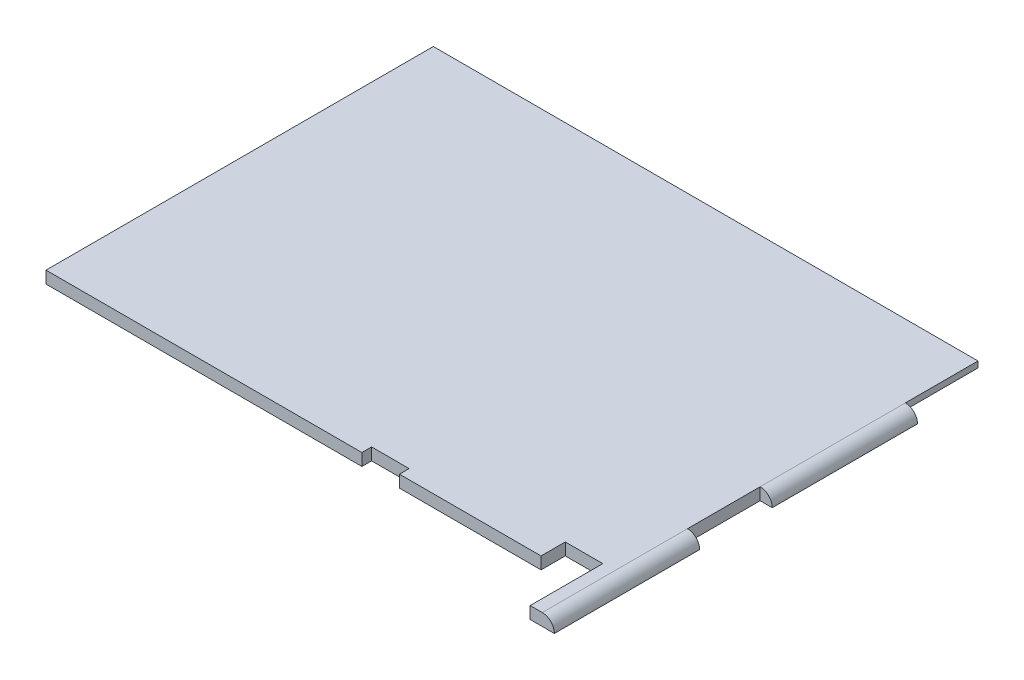
ISO-10303-21;
HEADER;
FILE_DESCRIPTION(('STEP AP214'),'2;1');
FILE_NAME('part.step','',(''),(''),'','','');
FILE_SCHEMA(('AUTOMOTIVE_DESIGN { 1 0 10303 214 1 1 1 1 }'));
ENDSEC;
DATA;
#1=APPLICATION_CONTEXT('core data for automotive mechanical design processes');
#2=APPLICATION_PROTOCOL_DEFINITION('international standard','automotive_design',2000,#1);
#3=PRODUCT_CONTEXT('',#1,'mechanical');
#4=PRODUCT('Part','Part','',(#3));
#5=PRODUCT_RELATED_PRODUCT_CATEGORY('part','',(#4));
#6=PRODUCT_DEFINITION_FORMATION('','',#4);
#7=PRODUCT_DEFINITION_CONTEXT('part definition',#1,'design');
#8=PRODUCT_DEFINITION('design','',#6,#7);
#9=PRODUCT_DEFINITION_SHAPE('','',#8);
#10=(LENGTH_UNIT() NAMED_UNIT(*) SI_UNIT(.MILLI.,.METRE.));
#11=(NAMED_UNIT(*) PLANE_ANGLE_UNIT() SI_UNIT($,.RADIAN.));
#12=(NAMED_UNIT(*) SI_UNIT($,.STERADIAN.) SOLID_ANGLE_UNIT());
#13=UNCERTAINTY_MEASURE_WITH_UNIT(LENGTH_MEASURE(1.E-05),#10,'distance_accuracy_value','');
#14=(GEOMETRIC_REPRESENTATION_CONTEXT(3) GLOBAL_UNCERTAINTY_ASSIGNED_CONTEXT((#13)) GLOBAL_UNIT_ASSIGNED_CONTEXT((#10,
#11,#12)) REPRESENTATION_CONTEXT('',''));
#15=CARTESIAN_POINT('',(0.,0.,0.));
#16=DIRECTION('',(0.,0.,1.));
#17=DIRECTION('',(1.,0.,0.));
#18=AXIS2_PLACEMENT_3D('',#15,#16,#17);
#19=CARTESIAN_POINT('',(0.,5.,286.464902660625));
#20=DIRECTION('',(0.,0.,-1.));
#21=DIRECTION('',(-1.,0.,0.));
#22=AXIS2_PLACEMENT_3D('',#19,#20,#21);
#23=PLANE('',#22);
#24=DIRECTION('',(1.,0.,0.));
#25=VECTOR('',#24,1.);
#26=CARTESIAN_POINT('',(0.,0.,286.464902660625));
#27=LINE('',#26,#25);
#28=CARTESIAN_POINT('',(198.746286717569,0.,286.464902660625));
#29=VERTEX_POINT('',#28);
#30=CARTESIAN_POINT('',(208.746286717569,0.,286.464902660625));
#31=VERTEX_POINT('',#30);
#32=EDGE_CURVE('E589',#29,#31,#27,.T.);
#33=ORIENTED_EDGE('',*,*,#32,.T.);
#34=CARTESIAN_POINT('',(203.746286717569,0.,286.464902660625));
#35=DIRECTION('',(0.,0.,-1.));
#36=DIRECTION('',(-1.,0.,0.));
#37=AXIS2_PLACEMENT_3D('',#34,#35,#36);
#38=CIRCLE('',#37,5.);
#39=CARTESIAN_POINT('',(203.746286717569,5.,286.464902660625));
#40=VERTEX_POINT('',#39);
#41=EDGE_CURVE('E12',#31,#40,#38,.F.);
#42=ORIENTED_EDGE('',*,*,#41,.T.);
#43=DIRECTION('',(1.,0.,0.));
#44=VECTOR('',#43,1.);
#45=CARTESIAN_POINT('',(0.,5.,286.464902660625));
#46=LINE('',#45,#44);
#47=CARTESIAN_POINT('',(198.746286717569,5.,286.464902660625));
#48=VERTEX_POINT('',#47);
#49=EDGE_CURVE('E554',#48,#40,#46,.T.);
#50=ORIENTED_EDGE('',*,*,#49,.F.);
#51=DIRECTION('',(0.,-1.,0.));
#52=VECTOR('',#51,1.);
#53=CARTESIAN_POINT('',(198.746286717569,5.,286.464902660625));
#54=LINE('',#53,#52);
#55=EDGE_CURVE('E640',#48,#29,#54,.T.);
#56=ORIENTED_EDGE('',*,*,#55,.T.);
#57=EDGE_LOOP('',(#33,#42,#50,#56));
#58=FACE_BOUND('',#57,.T.);
#59=ADVANCED_FACE('F403',(#58),#23,.F.);
#60=CARTESIAN_POINT('',(0.,5.,226.464902660625));
#61=DIRECTION('',(0.,0.,-1.));
#62=DIRECTION('',(-1.,0.,0.));
#63=AXIS2_PLACEMENT_3D('',#60,#61,#62);
#64=PLANE('',#63);
#65=DIRECTION('',(0.,-1.,0.));
#66=VECTOR('',#65,1.);
#67=CARTESIAN_POINT('',(203.746286717569,5.,226.464902660625));
#68=LINE('',#67,#66);
#69=CARTESIAN_POINT('',(203.746286717569,5.,226.464902660625));
#70=VERTEX_POINT('',#69);
#71=CARTESIAN_POINT('',(203.746286717569,0.,226.464902660625));
#72=VERTEX_POINT('',#71);
#73=EDGE_CURVE('E637',#70,#72,#68,.T.);
#74=ORIENTED_EDGE('',*,*,#73,.F.);
#75=CARTESIAN_POINT('',(203.746286717569,0.,226.464902660625));
#76=DIRECTION('',(0.,0.,-1.));
#77=DIRECTION('',(-1.,0.,0.));
#78=AXIS2_PLACEMENT_3D('',#75,#76,#77);
#79=CIRCLE('',#78,5.);
#80=CARTESIAN_POINT('',(208.746286717569,0.,226.464902660625));
#81=VERTEX_POINT('',#80);
#82=EDGE_CURVE('E411',#70,#81,#79,.T.);
#83=ORIENTED_EDGE('',*,*,#82,.T.);
#84=DIRECTION('',(1.,0.,0.));
#85=VECTOR('',#84,1.);
#86=CARTESIAN_POINT('',(0.,0.,226.464902660625));
#87=LINE('',#86,#85);
#88=EDGE_CURVE('E595',#72,#81,#87,.T.);
#89=ORIENTED_EDGE('',*,*,#88,.F.);
#90=EDGE_LOOP('',(#74,#83,#89));
#91=FACE_BOUND('',#90,.T.);
#92=ADVANCED_FACE('F666',(#91),#64,.T.);
#93=CARTESIAN_POINT('',(203.746286717569,5.,0.));
#94=DIRECTION('',(1.,0.,0.));
#95=DIRECTION('',(0.,0.,-1.));
#96=AXIS2_PLACEMENT_3D('',#93,#94,#95);
#97=PLANE('',#96);
#98=DIRECTION('',(0.,0.,1.));
#99=VECTOR('',#98,1.);
#100=CARTESIAN_POINT('',(203.746286717569,0.,0.));
#101=LINE('',#100,#99);
#102=CARTESIAN_POINT('',(203.746286717569,0.,196.464902660625));
#103=VERTEX_POINT('',#102);
#104=EDGE_CURVE('E598',#103,#72,#101,.T.);
#105=ORIENTED_EDGE('',*,*,#104,.F.);
#106=DIRECTION('',(0.,1.,0.));
#107=VECTOR('',#106,1.);
#108=CARTESIAN_POINT('',(203.746286717569,5.,196.464902660625));
#109=LINE('',#108,#107);
#110=CARTESIAN_POINT('',(203.746286717569,5.,196.464902660625));
#111=VERTEX_POINT('',#110);
#112=EDGE_CURVE('E644',#103,#111,#109,.T.);
#113=ORIENTED_EDGE('',*,*,#112,.T.);
#114=DIRECTION('',(0.,0.,1.));
#115=VECTOR('',#114,1.);
#116=CARTESIAN_POINT('',(203.746286717569,5.,0.));
#117=LINE('',#116,#115);
#118=EDGE_CURVE('E558',#111,#70,#117,.T.);
#119=ORIENTED_EDGE('',*,*,#118,.T.);
#120=ORIENTED_EDGE('',*,*,#73,.T.);
#121=EDGE_LOOP('',(#105,#113,#119,#120));
#122=FACE_BOUND('',#121,.T.);
#123=ADVANCED_FACE('F722',(#122),#97,.T.);
#124=DIRECTION('',(0.,0.,1.));
#125=VECTOR('',#124,1.);
#126=CARTESIAN_POINT('',(203.746286717569,2.5,106.464902660625));
#127=LINE('',#126,#125);
#128=CARTESIAN_POINT('',(203.746286717569,2.5,106.464902660625));
#129=VERTEX_POINT('',#128);
#130=CARTESIAN_POINT('',(203.746286717569,2.5,136.464902660625));
#131=VERTEX_POINT('',#130);
#132=EDGE_CURVE('E527',#129,#131,#127,.T.);
#133=ORIENTED_EDGE('',*,*,#132,.F.);
#134=DIRECTION('',(0.,1.,0.));
#135=VECTOR('',#134,1.);
#136=CARTESIAN_POINT('',(203.746286717569,5.,106.464902660625));
#137=LINE('',#136,#135);
#138=CARTESIAN_POINT('',(203.746286717569,5.,106.464902660625));
#139=VERTEX_POINT('',#138);
#140=EDGE_CURVE('E642',#129,#139,#137,.T.);
#141=ORIENTED_EDGE('',*,*,#140,.T.);
#142=CARTESIAN_POINT('',(203.746286717569,5.,136.464902660625));
#143=VERTEX_POINT('',#142);
#144=EDGE_CURVE('E561',#139,#143,#117,.T.);
#145=ORIENTED_EDGE('',*,*,#144,.T.);
#146=DIRECTION('',(0.,-1.,0.));
#147=VECTOR('',#146,1.);
#148=CARTESIAN_POINT('',(203.746286717569,5.,136.464902660625));
#149=LINE('',#148,#147);
#150=EDGE_CURVE('E647',#143,#131,#149,.T.);
#151=ORIENTED_EDGE('',*,*,#150,.T.);
#152=EDGE_LOOP('',(#133,#141,#145,#151));
#153=FACE_BOUND('',#152,.T.);
#154=ADVANCED_FACE('F726',(#153),#97,.T.);
#155=CARTESIAN_POINT('',(-21.2537132824313,5.,0.));
#156=DIRECTION('',(-1.,0.,0.));
#157=DIRECTION('',(0.,0.,1.));
#158=AXIS2_PLACEMENT_3D('',#155,#156,#157);
#159=PLANE('',#158);
#160=DIRECTION('',(0.,-1.,0.));
#161=VECTOR('',#160,1.);
#162=CARTESIAN_POINT('',(-21.2537132824313,0.,136.464902660625));
#163=LINE('',#162,#161);
#164=CARTESIAN_POINT('',(-21.2537132824313,2.5,136.464902660625));
#165=VERTEX_POINT('',#164);
#166=CARTESIAN_POINT('',(-21.2537132824313,0.,136.464902660625));
#167=VERTEX_POINT('',#166);
#168=EDGE_CURVE('E535',#165,#167,#163,.T.);
#169=ORIENTED_EDGE('',*,*,#168,.T.);
#170=DIRECTION('',(0.,0.,-1.));
#171=VECTOR('',#170,1.);
#172=CARTESIAN_POINT('',(-21.2537132824313,0.,0.));
#173=LINE('',#172,#171);
#174=CARTESIAN_POINT('',(-21.2537132824313,0.,266.464902660625));
#175=VERTEX_POINT('',#174);
#176=EDGE_CURVE('E600',#175,#167,#173,.T.);
#177=ORIENTED_EDGE('',*,*,#176,.F.);
#178=DIRECTION('',(0.,-1.,0.));
#179=VECTOR('',#178,1.);
#180=CARTESIAN_POINT('',(-21.2537132824313,5.,266.464902660625));
#181=LINE('',#180,#179);
#182=CARTESIAN_POINT('',(-21.2537132824313,5.,266.464902660625));
#183=VERTEX_POINT('',#182);
#184=EDGE_CURVE('E635',#183,#175,#181,.T.);
#185=ORIENTED_EDGE('',*,*,#184,.F.);
#186=DIRECTION('',(0.,0.,-1.));
#187=VECTOR('',#186,1.);
#188=CARTESIAN_POINT('',(-21.2537132824313,5.,0.));
#189=LINE('',#188,#187);
#190=CARTESIAN_POINT('',(-21.2537132824313,5.,106.464902660625));
#191=VERTEX_POINT('',#190);
#192=EDGE_CURVE('E562',#183,#191,#189,.T.);
#193=ORIENTED_EDGE('',*,*,#192,.T.);
#194=DIRECTION('',(0.,1.,0.));
#195=VECTOR('',#194,1.);
#196=CARTESIAN_POINT('',(-21.2537132824313,5.,106.464902660625));
#197=LINE('',#196,#195);
#198=CARTESIAN_POINT('',(-21.2537132824313,2.5,106.464902660625));
#199=VERTEX_POINT('',#198);
#200=EDGE_CURVE('E425',#199,#191,#197,.T.);
#201=ORIENTED_EDGE('',*,*,#200,.F.);
#202=DIRECTION('',(0.,0.,1.));
#203=VECTOR('',#202,1.);
#204=CARTESIAN_POINT('',(-21.2537132824313,2.5,106.464902660625));
#205=LINE('',#204,#203);
#206=EDGE_CURVE('E418',#199,#165,#205,.T.);
#207=ORIENTED_EDGE('',*,*,#206,.T.);
#208=EDGE_LOOP('',(#169,#177,#185,#193,#201,#207));
#209=FACE_BOUND('',#208,.T.);
#210=ADVANCED_FACE('F543',(#209),#159,.T.);
#211=CARTESIAN_POINT('',(0.,5.,266.464902660625));
#212=DIRECTION('',(0.,0.,1.));
#213=DIRECTION('',(1.,0.,0.));
#214=AXIS2_PLACEMENT_3D('',#211,#212,#213);
#215=PLANE('',#214);
#216=DIRECTION('',(-1.,0.,0.));
#217=VECTOR('',#216,1.);
#218=CARTESIAN_POINT('',(0.,0.,266.464902660625));
#219=LINE('',#218,#217);
#220=CARTESIAN_POINT('',(109.246286717569,0.,266.464902660625));
#221=VERTEX_POINT('',#220);
#222=EDGE_CURVE('E602',#221,#175,#219,.T.);
#223=ORIENTED_EDGE('',*,*,#222,.F.);
#224=DIRECTION('',(0.,-1.,0.));
#225=VECTOR('',#224,1.);
#226=CARTESIAN_POINT('',(109.246286717569,5.,266.464902660625));
#227=LINE('',#226,#225);
#228=CARTESIAN_POINT('',(109.246286717569,5.,266.464902660625));
#229=VERTEX_POINT('',#228);
#230=EDGE_CURVE('E633',#229,#221,#227,.T.);
#231=ORIENTED_EDGE('',*,*,#230,.F.);
#232=DIRECTION('',(-1.,0.,0.));
#233=VECTOR('',#232,1.);
#234=CARTESIAN_POINT('',(0.,5.,266.464902660625));
#235=LINE('',#234,#233);
#236=EDGE_CURVE('E564',#229,#183,#235,.T.);
#237=ORIENTED_EDGE('',*,*,#236,.T.);
#238=ORIENTED_EDGE('',*,*,#184,.T.);
#239=EDGE_LOOP('',(#223,#231,#237,#238));
#240=FACE_BOUND('',#239,.T.);
#241=ADVANCED_FACE('F712',(#240),#215,.T.);
#242=CARTESIAN_POINT('',(109.24628671757,5.,3.79024196464522E-13));
#243=DIRECTION('',(1.,0.,0.));
#244=DIRECTION('',(0.,0.,-1.));
#245=AXIS2_PLACEMENT_3D('',#242,#243,#244);
#246=PLANE('',#245);
#247=DIRECTION('',(0.,0.,1.));
#248=VECTOR('',#247,1.);
#249=CARTESIAN_POINT('',(109.24628671757,0.,3.79024196464522E-13));
#250=LINE('',#249,#248);
#251=CARTESIAN_POINT('',(109.246286717569,0.,262.464902660625));
#252=VERTEX_POINT('',#251);
#253=EDGE_CURVE('E605',#252,#221,#250,.T.);
#254=ORIENTED_EDGE('',*,*,#253,.F.);
#255=DIRECTION('',(0.,-1.,0.));
#256=VECTOR('',#255,1.);
#257=CARTESIAN_POINT('',(109.246286717569,5.,262.464902660625));
#258=LINE('',#257,#256);
#259=CARTESIAN_POINT('',(109.246286717569,5.,262.464902660625));
#260=VERTEX_POINT('',#259);
#261=EDGE_CURVE('E631',#260,#252,#258,.T.);
#262=ORIENTED_EDGE('',*,*,#261,.F.);
#263=DIRECTION('',(0.,0.,1.));
#264=VECTOR('',#263,1.);
#265=CARTESIAN_POINT('',(109.24628671757,5.,3.79024196464522E-13));
#266=LINE('',#265,#264);
#267=EDGE_CURVE('E567',#260,#229,#266,.T.);
#268=ORIENTED_EDGE('',*,*,#267,.T.);
#269=ORIENTED_EDGE('',*,*,#230,.T.);
#270=EDGE_LOOP('',(#254,#262,#268,#269));
#271=FACE_BOUND('',#270,.T.);
#272=ADVANCED_FACE('F708',(#271),#246,.T.);
#273=CARTESIAN_POINT('',(0.,5.,262.464902660625));
#274=DIRECTION('',(0.,0.,1.));
#275=DIRECTION('',(1.,0.,0.));
#276=AXIS2_PLACEMENT_3D('',#273,#274,#275);
#277=PLANE('',#276);
#278=DIRECTION('',(-1.,0.,0.));
#279=VECTOR('',#278,1.);
#280=CARTESIAN_POINT('',(0.,0.,262.464902660625));
#281=LINE('',#280,#279);
#282=CARTESIAN_POINT('',(124.746286717569,0.,262.464902660625));
#283=VERTEX_POINT('',#282);
#284=EDGE_CURVE('E608',#283,#252,#281,.T.);
#285=ORIENTED_EDGE('',*,*,#284,.F.);
#286=DIRECTION('',(0.,-1.,0.));
#287=VECTOR('',#286,1.);
#288=CARTESIAN_POINT('',(124.746286717569,5.,262.464902660625));
#289=LINE('',#288,#287);
#290=CARTESIAN_POINT('',(124.746286717569,5.,262.464902660625));
#291=VERTEX_POINT('',#290);
#292=EDGE_CURVE('E629',#291,#283,#289,.T.);
#293=ORIENTED_EDGE('',*,*,#292,.F.);
#294=DIRECTION('',(-1.,0.,0.));
#295=VECTOR('',#294,1.);
#296=CARTESIAN_POINT('',(0.,5.,262.464902660625));
#297=LINE('',#296,#295);
#298=EDGE_CURVE('E570',#291,#260,#297,.T.);
#299=ORIENTED_EDGE('',*,*,#298,.T.);
#300=ORIENTED_EDGE('',*,*,#261,.T.);
#301=EDGE_LOOP('',(#285,#293,#299,#300));
#302=FACE_BOUND('',#301,.T.);
#303=ADVANCED_FACE('F704',(#302),#277,.T.);
#304=CARTESIAN_POINT('',(124.746286717569,5.,0.));
#305=DIRECTION('',(-1.,0.,0.));
#306=DIRECTION('',(0.,0.,1.));
#307=AXIS2_PLACEMENT_3D('',#304,#305,#306);
#308=PLANE('',#307);
#309=DIRECTION('',(0.,0.,-1.));
#310=VECTOR('',#309,1.);
#311=CARTESIAN_POINT('',(124.746286717569,0.,0.));
#312=LINE('',#311,#310);
#313=CARTESIAN_POINT('',(124.746286717569,0.,266.464902660625));
#314=VERTEX_POINT('',#313);
#315=EDGE_CURVE('E611',#314,#283,#312,.T.);
#316=ORIENTED_EDGE('',*,*,#315,.F.);
#317=DIRECTION('',(0.,-1.,0.));
#318=VECTOR('',#317,1.);
#319=CARTESIAN_POINT('',(124.746286717569,5.,266.464902660625));
#320=LINE('',#319,#318);
#321=CARTESIAN_POINT('',(124.746286717569,5.,266.464902660625));
#322=VERTEX_POINT('',#321);
#323=EDGE_CURVE('E627',#322,#314,#320,.T.);
#324=ORIENTED_EDGE('',*,*,#323,.F.);
#325=DIRECTION('',(0.,0.,-1.));
#326=VECTOR('',#325,1.);
#327=CARTESIAN_POINT('',(124.746286717569,5.,0.));
#328=LINE('',#327,#326);
#329=EDGE_CURVE('E573',#322,#291,#328,.T.);
#330=ORIENTED_EDGE('',*,*,#329,.T.);
#331=ORIENTED_EDGE('',*,*,#292,.T.);
#332=EDGE_LOOP('',(#316,#324,#330,#331));
#333=FACE_BOUND('',#332,.T.);
#334=ADVANCED_FACE('F700',(#333),#308,.T.);
#335=CARTESIAN_POINT('',(0.,5.,266.464902660625));
#336=DIRECTION('',(0.,0.,1.));
#337=DIRECTION('',(1.,0.,0.));
#338=AXIS2_PLACEMENT_3D('',#335,#336,#337);
#339=PLANE('',#338);
#340=DIRECTION('',(-1.,0.,0.));
#341=VECTOR('',#340,1.);
#342=CARTESIAN_POINT('',(0.,0.,266.464902660625));
#343=LINE('',#342,#341);
#344=CARTESIAN_POINT('',(183.246286717569,0.,266.464902660625));
#345=VERTEX_POINT('',#344);
#346=EDGE_CURVE('E614',#345,#314,#343,.T.);
#347=ORIENTED_EDGE('',*,*,#346,.F.);
#348=DIRECTION('',(0.,-1.,0.));
#349=VECTOR('',#348,1.);
#350=CARTESIAN_POINT('',(183.246286717569,5.,266.464902660625));
#351=LINE('',#350,#349);
#352=CARTESIAN_POINT('',(183.246286717569,5.,266.464902660625));
#353=VERTEX_POINT('',#352);
#354=EDGE_CURVE('E625',#353,#345,#351,.T.);
#355=ORIENTED_EDGE('',*,*,#354,.F.);
#356=DIRECTION('',(-1.,0.,0.));
#357=VECTOR('',#356,1.);
#358=CARTESIAN_POINT('',(0.,5.,266.464902660625));
#359=LINE('',#358,#357);
#360=EDGE_CURVE('E576',#353,#322,#359,.T.);
#361=ORIENTED_EDGE('',*,*,#360,.T.);
#362=ORIENTED_EDGE('',*,*,#323,.T.);
#363=EDGE_LOOP('',(#347,#355,#361,#362));
#364=FACE_BOUND('',#363,.T.);
#365=ADVANCED_FACE('F696',(#364),#339,.T.);
#366=CARTESIAN_POINT('',(183.246286717569,5.,0.));
#367=DIRECTION('',(1.,0.,0.));
#368=DIRECTION('',(0.,0.,-1.));
#369=AXIS2_PLACEMENT_3D('',#366,#367,#368);
#370=PLANE('',#369);
#371=DIRECTION('',(0.,0.,1.));
#372=VECTOR('',#371,1.);
#373=CARTESIAN_POINT('',(183.246286717569,0.,0.));
#374=LINE('',#373,#372);
#375=CARTESIAN_POINT('',(183.246286717569,0.,256.464902660625));
#376=VERTEX_POINT('',#375);
#377=EDGE_CURVE('E617',#376,#345,#374,.T.);
#378=ORIENTED_EDGE('',*,*,#377,.F.);
#379=DIRECTION('',(0.,-1.,0.));
#380=VECTOR('',#379,1.);
#381=CARTESIAN_POINT('',(183.246286717569,5.,256.464902660625));
#382=LINE('',#381,#380);
#383=CARTESIAN_POINT('',(183.246286717569,5.,256.464902660625));
#384=VERTEX_POINT('',#383);
#385=EDGE_CURVE('E623',#384,#376,#382,.T.);
#386=ORIENTED_EDGE('',*,*,#385,.F.);
#387=DIRECTION('',(0.,0.,1.));
#388=VECTOR('',#387,1.);
#389=CARTESIAN_POINT('',(183.246286717569,5.,0.));
#390=LINE('',#389,#388);
#391=EDGE_CURVE('E579',#384,#353,#390,.T.);
#392=ORIENTED_EDGE('',*,*,#391,.T.);
#393=ORIENTED_EDGE('',*,*,#354,.T.);
#394=EDGE_LOOP('',(#378,#386,#392,#393));
#395=FACE_BOUND('',#394,.T.);
#396=ADVANCED_FACE('F692',(#395),#370,.T.);
#397=CARTESIAN_POINT('',(0.,5.,256.464902660625));
#398=DIRECTION('',(0.,0.,1.));
#399=DIRECTION('',(1.,0.,0.));
#400=AXIS2_PLACEMENT_3D('',#397,#398,#399);
#401=PLANE('',#400);
#402=DIRECTION('',(-1.,0.,0.));
#403=VECTOR('',#402,1.);
#404=CARTESIAN_POINT('',(0.,0.,256.464902660625));
#405=LINE('',#404,#403);
#406=CARTESIAN_POINT('',(198.746286717569,0.,256.464902660625));
#407=VERTEX_POINT('',#406);
#408=EDGE_CURVE('E555',#407,#376,#405,.T.);
#409=ORIENTED_EDGE('',*,*,#408,.F.);
#410=DIRECTION('',(0.,-1.,0.));
#411=VECTOR('',#410,1.);
#412=CARTESIAN_POINT('',(198.746286717569,5.,256.464902660625));
#413=LINE('',#412,#411);
#414=CARTESIAN_POINT('',(198.746286717569,5.,256.464902660625));
#415=VERTEX_POINT('',#414);
#416=EDGE_CURVE('E585',#415,#407,#413,.T.);
#417=ORIENTED_EDGE('',*,*,#416,.F.);
#418=DIRECTION('',(-1.,0.,0.));
#419=VECTOR('',#418,1.);
#420=CARTESIAN_POINT('',(0.,5.,256.464902660625));
#421=LINE('',#420,#419);
#422=EDGE_CURVE('E582',#415,#384,#421,.T.);
#423=ORIENTED_EDGE('',*,*,#422,.T.);
#424=ORIENTED_EDGE('',*,*,#385,.T.);
#425=EDGE_LOOP('',(#409,#417,#423,#424));
#426=FACE_BOUND('',#425,.T.);
#427=ADVANCED_FACE('F689',(#426),#401,.T.);
#428=CARTESIAN_POINT('',(198.746286717569,5.,0.));
#429=DIRECTION('',(-1.,0.,0.));
#430=DIRECTION('',(0.,0.,1.));
#431=AXIS2_PLACEMENT_3D('',#428,#429,#430);
#432=PLANE('',#431);
#433=DIRECTION('',(0.,0.,-1.));
#434=VECTOR('',#433,1.);
#435=CARTESIAN_POINT('',(198.746286717569,0.,0.));
#436=LINE('',#435,#434);
#437=EDGE_CURVE('E586',#29,#407,#436,.T.);
#438=ORIENTED_EDGE('',*,*,#437,.F.);
#439=ORIENTED_EDGE('',*,*,#55,.F.);
#440=DIRECTION('',(0.,0.,-1.));
#441=VECTOR('',#440,1.);
#442=CARTESIAN_POINT('',(198.746286717569,5.,0.));
#443=LINE('',#442,#441);
#444=EDGE_CURVE('E551',#48,#415,#443,.T.);
#445=ORIENTED_EDGE('',*,*,#444,.T.);
#446=ORIENTED_EDGE('',*,*,#416,.T.);
#447=EDGE_LOOP('',(#438,#439,#445,#446));
#448=FACE_BOUND('',#447,.T.);
#449=ADVANCED_FACE('F686',(#448),#432,.T.);
#450=CARTESIAN_POINT('',(0.,0.,0.));
#451=DIRECTION('',(0.,1.,0.));
#452=DIRECTION('',(0.,0.,1.));
#453=AXIS2_PLACEMENT_3D('',#450,#451,#452);
#454=PLANE('',#453);
#455=ORIENTED_EDGE('',*,*,#176,.T.);
#456=DIRECTION('',(1.,0.,0.));
#457=VECTOR('',#456,1.);
#458=CARTESIAN_POINT('',(203.746286717569,0.,136.464902660625));
#459=LINE('',#458,#457);
#460=CARTESIAN_POINT('',(208.746286717569,0.,136.464902660625));
#461=VERTEX_POINT('',#460);
#462=EDGE_CURVE('E538',#167,#461,#459,.T.);
#463=ORIENTED_EDGE('',*,*,#462,.T.);
#464=DIRECTION('',(0.,0.,1.));
#465=VECTOR('',#464,1.);
#466=CARTESIAN_POINT('',(208.746286717569,0.,136.464902660625));
#467=LINE('',#466,#465);
#468=CARTESIAN_POINT('',(208.746286717569,0.,196.464902660625));
#469=VERTEX_POINT('',#468);
#470=EDGE_CURVE('E649',#461,#469,#467,.T.);
#471=ORIENTED_EDGE('',*,*,#470,.T.);
#472=DIRECTION('',(1.,0.,0.));
#473=VECTOR('',#472,1.);
#474=CARTESIAN_POINT('',(203.746286717569,0.,196.464902660625));
#475=LINE('',#474,#473);
#476=EDGE_CURVE('E590',#103,#469,#475,.T.);
#477=ORIENTED_EDGE('',*,*,#476,.F.);
#478=ORIENTED_EDGE('',*,*,#104,.T.);
#479=ORIENTED_EDGE('',*,*,#88,.T.);
#480=DIRECTION('',(0.,0.,-1.));
#481=VECTOR('',#480,1.);
#482=CARTESIAN_POINT('',(208.746286717569,0.,0.));
#483=LINE('',#482,#481);
#484=EDGE_CURVE('E592',#31,#81,#483,.T.);
#485=ORIENTED_EDGE('',*,*,#484,.F.);
#486=ORIENTED_EDGE('',*,*,#32,.F.);
#487=ORIENTED_EDGE('',*,*,#437,.T.);
#488=ORIENTED_EDGE('',*,*,#408,.T.);
#489=ORIENTED_EDGE('',*,*,#377,.T.);
#490=ORIENTED_EDGE('',*,*,#346,.T.);
#491=ORIENTED_EDGE('',*,*,#315,.T.);
#492=ORIENTED_EDGE('',*,*,#284,.T.);
#493=ORIENTED_EDGE('',*,*,#253,.T.);
#494=ORIENTED_EDGE('',*,*,#222,.T.);
#495=EDGE_LOOP('',(#455,#463,#471,#477,#478,#479,#485,#486,#487,#488,#489,#490,#491,#492,#493,#494));
#496=FACE_BOUND('',#495,.T.);
#497=ADVANCED_FACE('F671',(#496),#454,.F.);
#498=CARTESIAN_POINT('',(0.,5.,0.));
#499=DIRECTION('',(0.,1.,0.));
#500=DIRECTION('',(0.,0.,1.));
#501=AXIS2_PLACEMENT_3D('',#498,#499,#500);
#502=PLANE('',#501);
#503=DIRECTION('',(1.,0.,0.));
#504=VECTOR('',#503,1.);
#505=CARTESIAN_POINT('',(-36.2537132824313,5.,106.464902660625));
#506=LINE('',#505,#504);
#507=EDGE_CURVE('E531',#191,#139,#506,.T.);
#508=ORIENTED_EDGE('',*,*,#507,.F.);
#509=ORIENTED_EDGE('',*,*,#192,.F.);
#510=ORIENTED_EDGE('',*,*,#236,.F.);
#511=ORIENTED_EDGE('',*,*,#267,.F.);
#512=ORIENTED_EDGE('',*,*,#298,.F.);
#513=ORIENTED_EDGE('',*,*,#329,.F.);
#514=ORIENTED_EDGE('',*,*,#360,.F.);
#515=ORIENTED_EDGE('',*,*,#391,.F.);
#516=ORIENTED_EDGE('',*,*,#422,.F.);
#517=ORIENTED_EDGE('',*,*,#444,.F.);
#518=ORIENTED_EDGE('',*,*,#49,.T.);
#519=DIRECTION('',(0.,0.,-1.));
#520=VECTOR('',#519,1.);
#521=CARTESIAN_POINT('',(203.746286717569,5.,226.464902660625));
#522=LINE('',#521,#520);
#523=EDGE_CURVE('E655',#40,#70,#522,.T.);
#524=ORIENTED_EDGE('',*,*,#523,.T.);
#525=ORIENTED_EDGE('',*,*,#118,.F.);
#526=DIRECTION('',(0.,0.,1.));
#527=VECTOR('',#526,1.);
#528=CARTESIAN_POINT('',(203.746286717569,5.,0.));
#529=LINE('',#528,#527);
#530=EDGE_CURVE('E658',#111,#143,#529,.F.);
#531=ORIENTED_EDGE('',*,*,#530,.T.);
#532=ORIENTED_EDGE('',*,*,#144,.F.);
#533=EDGE_LOOP('',(#508,#509,#510,#511,#512,#513,#514,#515,#516,#517,#518,#524,#525,#531,#532));
#534=FACE_BOUND('',#533,.T.);
#535=ADVANCED_FACE('F680',(#534),#502,.T.);
#536=CARTESIAN_POINT('',(203.746286717569,5.,196.464902660625));
#537=DIRECTION('',(0.,0.,-1.));
#538=DIRECTION('',(-1.,0.,0.));
#539=AXIS2_PLACEMENT_3D('',#536,#537,#538);
#540=PLANE('',#539);
#541=ORIENTED_EDGE('',*,*,#476,.T.);
#542=CARTESIAN_POINT('',(203.746286717569,0.,196.464902660625));
#543=DIRECTION('',(0.,0.,-1.));
#544=DIRECTION('',(-1.,0.,0.));
#545=AXIS2_PLACEMENT_3D('',#542,#543,#544);
#546=CIRCLE('',#545,5.);
#547=EDGE_CURVE('E660',#469,#111,#546,.F.);
#548=ORIENTED_EDGE('',*,*,#547,.T.);
#549=ORIENTED_EDGE('',*,*,#112,.F.);
#550=EDGE_LOOP('',(#541,#548,#549));
#551=FACE_BOUND('',#550,.T.);
#552=ADVANCED_FACE('F720',(#551),#540,.F.);
#553=CARTESIAN_POINT('',(203.746286717569,5.,136.464902660625));
#554=DIRECTION('',(0.,0.,-1.));
#555=DIRECTION('',(-1.,0.,0.));
#556=AXIS2_PLACEMENT_3D('',#553,#554,#555);
#557=PLANE('',#556);
#558=ORIENTED_EDGE('',*,*,#150,.F.);
#559=CARTESIAN_POINT('',(203.746286717569,0.,136.464902660625));
#560=DIRECTION('',(0.,0.,-1.));
#561=DIRECTION('',(-1.,0.,0.));
#562=AXIS2_PLACEMENT_3D('',#559,#560,#561);
#563=CIRCLE('',#562,5.);
#564=EDGE_CURVE('E662',#143,#461,#563,.T.);
#565=ORIENTED_EDGE('',*,*,#564,.T.);
#566=ORIENTED_EDGE('',*,*,#462,.F.);
#567=ORIENTED_EDGE('',*,*,#168,.F.);
#568=DIRECTION('',(1.,0.,0.));
#569=VECTOR('',#568,1.);
#570=CARTESIAN_POINT('',(-21.2537132824313,2.5,136.464902660625));
#571=LINE('',#570,#569);
#572=EDGE_CURVE('E523',#165,#131,#571,.T.);
#573=ORIENTED_EDGE('',*,*,#572,.T.);
#574=EDGE_LOOP('',(#558,#565,#566,#567,#573));
#575=FACE_BOUND('',#574,.T.);
#576=ADVANCED_FACE('F536',(#575),#557,.T.);
#577=CARTESIAN_POINT('',(203.746286717569,0.,136.464902660625));
#578=DIRECTION('',(0.,0.,1.));
#579=DIRECTION('',(1.,0.,0.));
#580=AXIS2_PLACEMENT_3D('',#577,#578,#579);
#581=CYLINDRICAL_SURFACE('',#580,5.);
#582=ORIENTED_EDGE('',*,*,#564,.F.);
#583=ORIENTED_EDGE('',*,*,#530,.F.);
#584=ORIENTED_EDGE('',*,*,#547,.F.);
#585=ORIENTED_EDGE('',*,*,#470,.F.);
#586=EDGE_LOOP('',(#582,#583,#584,#585));
#587=FACE_BOUND('',#586,.T.);
#588=ADVANCED_FACE('F717',(#587),#581,.T.);
#589=CARTESIAN_POINT('',(203.746286717569,0.,0.));
#590=DIRECTION('',(0.,0.,1.));
#591=DIRECTION('',(1.,0.,0.));
#592=AXIS2_PLACEMENT_3D('',#589,#590,#591);
#593=CYLINDRICAL_SURFACE('',#592,5.);
#594=ORIENTED_EDGE('',*,*,#41,.F.);
#595=ORIENTED_EDGE('',*,*,#484,.T.);
#596=ORIENTED_EDGE('',*,*,#82,.F.);
#597=ORIENTED_EDGE('',*,*,#523,.F.);
#598=EDGE_LOOP('',(#594,#595,#596,#597));
#599=FACE_BOUND('',#598,.T.);
#600=ADVANCED_FACE('F405',(#599),#593,.T.);
#601=CARTESIAN_POINT('',(-36.2537132824313,0.,106.464902660625));
#602=DIRECTION('',(0.,0.,1.));
#603=DIRECTION('',(1.,0.,0.));
#604=AXIS2_PLACEMENT_3D('',#601,#602,#603);
#605=PLANE('',#604);
#606=ORIENTED_EDGE('',*,*,#140,.F.);
#607=DIRECTION('',(1.,0.,0.));
#608=VECTOR('',#607,1.);
#609=CARTESIAN_POINT('',(-21.2537132824313,2.5,106.464902660625));
#610=LINE('',#609,#608);
#611=EDGE_CURVE('E532',#199,#129,#610,.T.);
#612=ORIENTED_EDGE('',*,*,#611,.F.);
#613=ORIENTED_EDGE('',*,*,#200,.T.);
#614=ORIENTED_EDGE('',*,*,#507,.T.);
#615=EDGE_LOOP('',(#606,#612,#613,#614));
#616=FACE_BOUND('',#615,.T.);
#617=ADVANCED_FACE('F728',(#616),#605,.F.);
#618=CARTESIAN_POINT('',(-21.2537132824313,2.5,106.464902660625));
#619=DIRECTION('',(0.,1.,0.));
#620=DIRECTION('',(0.,0.,1.));
#621=AXIS2_PLACEMENT_3D('',#618,#619,#620);
#622=PLANE('',#621);
#623=ORIENTED_EDGE('',*,*,#132,.T.);
#624=ORIENTED_EDGE('',*,*,#572,.F.);
#625=ORIENTED_EDGE('',*,*,#206,.F.);
#626=ORIENTED_EDGE('',*,*,#611,.T.);
#627=EDGE_LOOP('',(#623,#624,#625,#626));
#628=FACE_BOUND('',#627,.T.);
#629=ADVANCED_FACE('F525',(#628),#622,.F.);
#630=CLOSED_SHELL('',(#59,#92,#123,#154,#210,#241,#272,#303,#334,#365,#396,#427,#449,#497,#535,
#552,#576,#588,#600,#617,#629));
#631=MANIFOLD_SOLID_BREP('B2',#630);
#632=ADVANCED_BREP_SHAPE_REPRESENTATION('',(#18,#631),#14);
#633=SHAPE_DEFINITION_REPRESENTATION(#9,#632);
ENDSEC;
END-ISO-10303-21;
